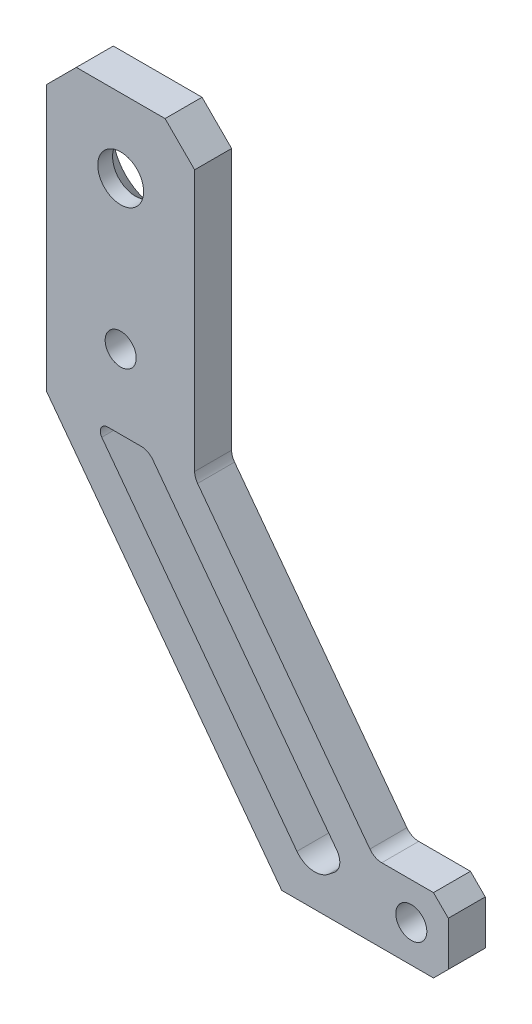
ISO-10303-21;
HEADER;
FILE_DESCRIPTION(('STEP AP214'),'2;1');
FILE_NAME('part.step','',(''),(''),'','','');
FILE_SCHEMA(('AUTOMOTIVE_DESIGN { 1 0 10303 214 1 1 1 1 }'));
ENDSEC;
DATA;
#1=APPLICATION_CONTEXT('core data for automotive mechanical design processes');
#2=APPLICATION_PROTOCOL_DEFINITION('international standard','automotive_design',2000,#1);
#3=PRODUCT_CONTEXT('',#1,'mechanical');
#4=PRODUCT('Part','Part','',(#3));
#5=PRODUCT_RELATED_PRODUCT_CATEGORY('part','',(#4));
#6=PRODUCT_DEFINITION_FORMATION('','',#4);
#7=PRODUCT_DEFINITION_CONTEXT('part definition',#1,'design');
#8=PRODUCT_DEFINITION('design','',#6,#7);
#9=PRODUCT_DEFINITION_SHAPE('','',#8);
#10=(LENGTH_UNIT() NAMED_UNIT(*) SI_UNIT(.MILLI.,.METRE.));
#11=(NAMED_UNIT(*) PLANE_ANGLE_UNIT() SI_UNIT($,.RADIAN.));
#12=(NAMED_UNIT(*) SI_UNIT($,.STERADIAN.) SOLID_ANGLE_UNIT());
#13=UNCERTAINTY_MEASURE_WITH_UNIT(LENGTH_MEASURE(1.E-05),#10,'distance_accuracy_value','');
#14=(GEOMETRIC_REPRESENTATION_CONTEXT(3) GLOBAL_UNCERTAINTY_ASSIGNED_CONTEXT((#13)) GLOBAL_UNIT_ASSIGNED_CONTEXT((#10,
#11,#12)) REPRESENTATION_CONTEXT('',''));
#15=CARTESIAN_POINT('',(0.,0.,0.));
#16=DIRECTION('',(0.,0.,1.));
#17=DIRECTION('',(1.,0.,0.));
#18=AXIS2_PLACEMENT_3D('',#15,#16,#17);
#19=CARTESIAN_POINT('',(0.,0.,2.5));
#20=DIRECTION('',(0.,0.,1.));
#21=DIRECTION('',(1.,0.,0.));
#22=AXIS2_PLACEMENT_3D('',#19,#20,#21);
#23=PLANE('',#22);
#24=CARTESIAN_POINT('',(0.,-20.,2.5));
#25=DIRECTION('',(0.,0.,1.));
#26=DIRECTION('',(1.,0.,0.));
#27=AXIS2_PLACEMENT_3D('',#24,#25,#26);
#28=CIRCLE('',#27,2.1);
#29=CARTESIAN_POINT('',(2.1,-20.,2.5));
#30=VERTEX_POINT('',#29);
#31=EDGE_CURVE('E527',#30,#30,#28,.T.);
#32=ORIENTED_EDGE('',*,*,#31,.F.);
#33=EDGE_LOOP('',(#32));
#34=FACE_BOUND('',#33,.T.);
#35=CARTESIAN_POINT('',(39.3,-67.5,2.5));
#36=DIRECTION('',(0.,0.,1.));
#37=DIRECTION('',(1.,0.,0.));
#38=AXIS2_PLACEMENT_3D('',#35,#36,#37);
#39=CIRCLE('',#38,2.1);
#40=CARTESIAN_POINT('',(41.4,-67.5,2.5));
#41=VERTEX_POINT('',#40);
#42=EDGE_CURVE('E230',#41,#41,#39,.T.);
#43=ORIENTED_EDGE('',*,*,#42,.F.);
#44=EDGE_LOOP('',(#43));
#45=FACE_BOUND('',#44,.T.);
#46=DIRECTION('',(1.,0.,0.));
#47=VECTOR('',#46,1.);
#48=CARTESIAN_POINT('',(21.7769230769231,-72.5,2.5));
#49=LINE('',#48,#47);
#50=CARTESIAN_POINT('',(21.7769230769231,-72.5,2.5));
#51=VERTEX_POINT('',#50);
#52=CARTESIAN_POINT('',(42.3,-72.5,2.5));
#53=VERTEX_POINT('',#52);
#54=EDGE_CURVE('E211',#51,#53,#49,.T.);
#55=ORIENTED_EDGE('',*,*,#54,.T.);
#56=DIRECTION('',(-0.707106781186552,-0.707106781186543,0.));
#57=VECTOR('',#56,1.);
#58=CARTESIAN_POINT('',(57.3999999999997,-57.4000000000005,2.5));
#59=LINE('',#58,#57);
#60=CARTESIAN_POINT('',(44.3,-70.5,2.5));
#61=VERTEX_POINT('',#60);
#62=EDGE_CURVE('E326',#53,#61,#59,.F.);
#63=ORIENTED_EDGE('',*,*,#62,.T.);
#64=DIRECTION('',(0.,1.,0.));
#65=VECTOR('',#64,1.);
#66=CARTESIAN_POINT('',(44.3,-72.5,2.5));
#67=LINE('',#66,#65);
#68=CARTESIAN_POINT('',(44.3,-64.5,2.5));
#69=VERTEX_POINT('',#68);
#70=EDGE_CURVE('E213',#61,#69,#67,.T.);
#71=ORIENTED_EDGE('',*,*,#70,.T.);
#72=DIRECTION('',(0.707106781186544,-0.707106781186551,0.));
#73=VECTOR('',#72,1.);
#74=CARTESIAN_POINT('',(-10.0999999999998,-10.0999999999997,2.5));
#75=LINE('',#74,#73);
#76=CARTESIAN_POINT('',(42.3,-62.5,2.5));
#77=VERTEX_POINT('',#76);
#78=EDGE_CURVE('E324',#69,#77,#75,.F.);
#79=ORIENTED_EDGE('',*,*,#78,.T.);
#80=DIRECTION('',(-1.,0.,0.));
#81=VECTOR('',#80,1.);
#82=CARTESIAN_POINT('',(44.3,-62.5,2.5));
#83=LINE('',#82,#81);
#84=CARTESIAN_POINT('',(35.3018488834955,-62.5,2.5));
#85=VERTEX_POINT('',#84);
#86=EDGE_CURVE('E219',#77,#85,#83,.T.);
#87=ORIENTED_EDGE('',*,*,#86,.T.);
#88=CARTESIAN_POINT('',(35.3018488834955,-60.5,2.5));
#89=DIRECTION('',(0.,0.,1.));
#90=DIRECTION('',(1.,0.,0.));
#91=AXIS2_PLACEMENT_3D('',#88,#89,#90);
#92=CIRCLE('',#91,2.);
#93=CARTESIAN_POINT('',(33.7000763613049,-61.6976329935148,2.5));
#94=VERTEX_POINT('',#93);
#95=EDGE_CURVE('E272',#85,#94,#92,.F.);
#96=ORIENTED_EDGE('',*,*,#95,.T.);
#97=DIRECTION('',(-0.598816496757402,0.80088626109529,0.));
#98=VECTOR('',#97,1.);
#99=CARTESIAN_POINT('',(34.3,-62.5,2.5));
#100=LINE('',#99,#98);
#101=CARTESIAN_POINT('',(10.3982274778094,-30.5326087666175,2.5));
#102=VERTEX_POINT('',#101);
#103=EDGE_CURVE('E221',#94,#102,#100,.T.);
#104=ORIENTED_EDGE('',*,*,#103,.T.);
#105=CARTESIAN_POINT('',(12.,-29.3349757731027,2.5));
#106=DIRECTION('',(0.,0.,1.));
#107=DIRECTION('',(1.,0.,0.));
#108=AXIS2_PLACEMENT_3D('',#105,#106,#107);
#109=CIRCLE('',#108,2.);
#110=CARTESIAN_POINT('',(10.,-29.3349757731027,2.5));
#111=VERTEX_POINT('',#110);
#112=EDGE_CURVE('E276',#102,#111,#109,.F.);
#113=ORIENTED_EDGE('',*,*,#112,.T.);
#114=DIRECTION('',(0.,1.,0.));
#115=VECTOR('',#114,1.);
#116=CARTESIAN_POINT('',(10.,-30.,2.5));
#117=LINE('',#116,#115);
#118=CARTESIAN_POINT('',(10.,6.,2.5));
#119=VERTEX_POINT('',#118);
#120=EDGE_CURVE('E224',#111,#119,#117,.T.);
#121=ORIENTED_EDGE('',*,*,#120,.T.);
#122=DIRECTION('',(0.707106781186546,-0.707106781186549,0.));
#123=VECTOR('',#122,1.);
#124=CARTESIAN_POINT('',(8.00000000000002,7.99999999999999,2.5));
#125=LINE('',#124,#123);
#126=CARTESIAN_POINT('',(6.00000000000001,10.,2.5));
#127=VERTEX_POINT('',#126);
#128=EDGE_CURVE('E309',#119,#127,#125,.F.);
#129=ORIENTED_EDGE('',*,*,#128,.T.);
#130=DIRECTION('',(-1.,0.,0.));
#131=VECTOR('',#130,1.);
#132=CARTESIAN_POINT('',(10.,10.,2.5));
#133=LINE('',#132,#131);
#134=CARTESIAN_POINT('',(-6.,10.,2.5));
#135=VERTEX_POINT('',#134);
#136=EDGE_CURVE('E196',#127,#135,#133,.T.);
#137=ORIENTED_EDGE('',*,*,#136,.T.);
#138=DIRECTION('',(0.707106781186549,0.707106781186546,0.));
#139=VECTOR('',#138,1.);
#140=CARTESIAN_POINT('',(-7.99999999999999,8.00000000000002,2.5));
#141=LINE('',#140,#139);
#142=CARTESIAN_POINT('',(-10.,6.00000000000001,2.5));
#143=VERTEX_POINT('',#142);
#144=EDGE_CURVE('E192',#135,#143,#141,.F.);
#145=ORIENTED_EDGE('',*,*,#144,.T.);
#146=DIRECTION('',(0.,-1.,0.));
#147=VECTOR('',#146,1.);
#148=CARTESIAN_POINT('',(-10.,10.,2.5));
#149=LINE('',#148,#147);
#150=CARTESIAN_POINT('',(-9.99999999999999,-30.,2.5));
#151=VERTEX_POINT('',#150);
#152=EDGE_CURVE('E183',#143,#151,#149,.T.);
#153=ORIENTED_EDGE('',*,*,#152,.T.);
#154=DIRECTION('',(0.598816496757402,-0.80088626109529,0.));
#155=VECTOR('',#154,1.);
#156=CARTESIAN_POINT('',(-9.99999999999999,-30.,2.5));
#157=LINE('',#156,#155);
#158=EDGE_CURVE('E188',#151,#51,#157,.T.);
#159=ORIENTED_EDGE('',*,*,#158,.T.);
#160=EDGE_LOOP('',(#55,#63,#71,#79,#87,#96,#104,#113,#121,#129,#137,#145,#153,#159));
#161=FACE_BOUND('',#160,.T.);
#162=CARTESIAN_POINT('',(0.,0.,2.5));
#163=DIRECTION('',(0.,0.,1.));
#164=DIRECTION('',(1.,0.,0.));
#165=AXIS2_PLACEMENT_3D('',#162,#163,#164);
#166=CIRCLE('',#165,3.1);
#167=CARTESIAN_POINT('',(3.1,0.,2.5));
#168=VERTEX_POINT('',#167);
#169=EDGE_CURVE('E458',#168,#168,#166,.T.);
#170=ORIENTED_EDGE('',*,*,#169,.F.);
#171=EDGE_LOOP('',(#170));
#172=FACE_BOUND('',#171,.T.);
#173=DIRECTION('',(0.781430437850523,0.623992364376953,0.));
#174=VECTOR('',#173,1.);
#175=CARTESIAN_POINT('',(25.6860539770931,-69.3784581263998,2.5));
#176=LINE('',#175,#174);
#177=CARTESIAN_POINT('',(28.1061503386972,-67.4459487467406,2.5));
#178=VERTEX_POINT('',#177);
#179=CARTESIAN_POINT('',(28.8769619540967,-66.8304357860407,2.5));
#180=VERTEX_POINT('',#179);
#181=EDGE_CURVE('E465',#178,#180,#176,.T.);
#182=ORIENTED_EDGE('',*,*,#181,.F.);
#183=CARTESIAN_POINT('',(26.2341732455664,-65.101657433189,2.5));
#184=DIRECTION('',(0.,0.,1.));
#185=DIRECTION('',(1.,0.,0.));
#186=AXIS2_PLACEMENT_3D('',#183,#184,#185);
#187=CIRCLE('',#186,3.);
#188=CARTESIAN_POINT('',(23.8315144622805,-66.8981069234612,2.5));
#189=VERTEX_POINT('',#188);
#190=EDGE_CURVE('E294',#178,#189,#187,.F.);
#191=ORIENTED_EDGE('',*,*,#190,.T.);
#192=DIRECTION('',(0.598816496757401,-0.80088626109529,0.));
#193=VECTOR('',#192,1.);
#194=CARTESIAN_POINT('',(-3.75691625279971,-30.,2.5));
#195=LINE('',#194,#193);
#196=CARTESIAN_POINT('',(-2.56149345676264,-31.5988164967574,2.5));
#197=VERTEX_POINT('',#196);
#198=EDGE_CURVE('E454',#197,#189,#195,.T.);
#199=ORIENTED_EDGE('',*,*,#198,.F.);
#200=CARTESIAN_POINT('',(-1.76060719566735,-31.,2.5));
#201=DIRECTION('',(0.,0.,1.));
#202=DIRECTION('',(1.,0.,0.));
#203=AXIS2_PLACEMENT_3D('',#200,#201,#202);
#204=CIRCLE('',#203,1.);
#205=CARTESIAN_POINT('',(-1.76060719566735,-30.,2.5));
#206=VERTEX_POINT('',#205);
#207=EDGE_CURVE('E336',#197,#206,#204,.F.);
#208=ORIENTED_EDGE('',*,*,#207,.T.);
#209=DIRECTION('',(-1.,0.,0.));
#210=VECTOR('',#209,1.);
#211=CARTESIAN_POINT('',(-3.75691625279971,-30.,2.5));
#212=LINE('',#211,#210);
#213=CARTESIAN_POINT('',(2.75506736930424,-30.,2.5));
#214=VERTEX_POINT('',#213);
#215=EDGE_CURVE('E452',#214,#206,#212,.T.);
#216=ORIENTED_EDGE('',*,*,#215,.F.);
#217=CARTESIAN_POINT('',(2.75506736930424,-32.,2.5));
#218=DIRECTION('',(0.,0.,1.));
#219=DIRECTION('',(1.,0.,0.));
#220=AXIS2_PLACEMENT_3D('',#217,#218,#219);
#221=CIRCLE('',#220,2.);
#222=CARTESIAN_POINT('',(4.35683989149483,-30.8023670064852,2.5));
#223=VERTEX_POINT('',#222);
#224=EDGE_CURVE('E280',#214,#223,#221,.F.);
#225=ORIENTED_EDGE('',*,*,#224,.T.);
#226=DIRECTION('',(-0.598816496757401,0.80088626109529,0.));
#227=VECTOR('',#226,1.);
#228=CARTESIAN_POINT('',(30.39086909983,-65.6215418736001,2.5));
#229=LINE('',#228,#227);
#230=CARTESIAN_POINT('',(29.2307497475334,-64.0699419168248,2.5));
#231=VERTEX_POINT('',#230);
#232=EDGE_CURVE('E459',#231,#223,#229,.T.);
#233=ORIENTED_EDGE('',*,*,#232,.F.);
#234=CARTESIAN_POINT('',(27.6289772253428,-65.2675749103396,2.5));
#235=DIRECTION('',(0.,0.,1.));
#236=DIRECTION('',(1.,0.,0.));
#237=AXIS2_PLACEMENT_3D('',#234,#235,#236);
#238=CIRCLE('',#237,2.);
#239=EDGE_CURVE('E284',#231,#180,#238,.F.);
#240=ORIENTED_EDGE('',*,*,#239,.T.);
#241=EDGE_LOOP('',(#182,#191,#199,#208,#216,#225,#233,#240));
#242=FACE_BOUND('',#241,.T.);
#243=ADVANCED_FACE('F34',(#34,#45,#161,#172,#242),#23,.T.);
#244=CARTESIAN_POINT('',(0.,0.,-2.5));
#245=DIRECTION('',(0.,0.,1.));
#246=DIRECTION('',(1.,0.,0.));
#247=AXIS2_PLACEMENT_3D('',#244,#245,#246);
#248=PLANE('',#247);
#249=CARTESIAN_POINT('',(0.,0.,-2.5));
#250=DIRECTION('',(0.,0.,1.));
#251=DIRECTION('',(1.,0.,0.));
#252=AXIS2_PLACEMENT_3D('',#249,#250,#251);
#253=CIRCLE('',#252,6.09999999999999);
#254=CARTESIAN_POINT('',(6.09999999999999,0.,-2.5));
#255=VERTEX_POINT('',#254);
#256=EDGE_CURVE('E43',#255,#255,#253,.T.);
#257=ORIENTED_EDGE('',*,*,#256,.T.);
#258=EDGE_LOOP('',(#257));
#259=FACE_BOUND('',#258,.T.);
#260=CARTESIAN_POINT('',(0.,-20.,-2.5));
#261=DIRECTION('',(0.,0.,1.));
#262=DIRECTION('',(1.,0.,0.));
#263=AXIS2_PLACEMENT_3D('',#260,#261,#262);
#264=CIRCLE('',#263,2.1);
#265=CARTESIAN_POINT('',(2.1,-20.,-2.5));
#266=VERTEX_POINT('',#265);
#267=EDGE_CURVE('E472',#266,#266,#264,.T.);
#268=ORIENTED_EDGE('',*,*,#267,.T.);
#269=EDGE_LOOP('',(#268));
#270=FACE_BOUND('',#269,.T.);
#271=CARTESIAN_POINT('',(39.3,-67.5,-2.5));
#272=DIRECTION('',(0.,0.,1.));
#273=DIRECTION('',(1.,0.,0.));
#274=AXIS2_PLACEMENT_3D('',#271,#272,#273);
#275=CIRCLE('',#274,2.1);
#276=CARTESIAN_POINT('',(41.4,-67.5,-2.5));
#277=VERTEX_POINT('',#276);
#278=EDGE_CURVE('E462',#277,#277,#275,.T.);
#279=ORIENTED_EDGE('',*,*,#278,.T.);
#280=EDGE_LOOP('',(#279));
#281=FACE_BOUND('',#280,.T.);
#282=DIRECTION('',(0.,1.,0.));
#283=VECTOR('',#282,1.);
#284=CARTESIAN_POINT('',(44.3,-72.5,-2.5));
#285=LINE('',#284,#283);
#286=CARTESIAN_POINT('',(44.3,-70.5,-2.5));
#287=VERTEX_POINT('',#286);
#288=CARTESIAN_POINT('',(44.3,-64.5,-2.5));
#289=VERTEX_POINT('',#288);
#290=EDGE_CURVE('E237',#287,#289,#285,.T.);
#291=ORIENTED_EDGE('',*,*,#290,.F.);
#292=DIRECTION('',(0.707106781186552,0.707106781186543,0.));
#293=VECTOR('',#292,1.);
#294=CARTESIAN_POINT('',(44.3,-70.5,-2.5));
#295=LINE('',#294,#293);
#296=CARTESIAN_POINT('',(42.3,-72.5,-2.5));
#297=VERTEX_POINT('',#296);
#298=EDGE_CURVE('E320',#287,#297,#295,.F.);
#299=ORIENTED_EDGE('',*,*,#298,.T.);
#300=DIRECTION('',(1.,0.,0.));
#301=VECTOR('',#300,1.);
#302=CARTESIAN_POINT('',(21.7769230769231,-72.5,-2.5));
#303=LINE('',#302,#301);
#304=CARTESIAN_POINT('',(21.7769230769231,-72.5,-2.5));
#305=VERTEX_POINT('',#304);
#306=EDGE_CURVE('E234',#305,#297,#303,.T.);
#307=ORIENTED_EDGE('',*,*,#306,.F.);
#308=DIRECTION('',(0.598816496757402,-0.80088626109529,0.));
#309=VECTOR('',#308,1.);
#310=CARTESIAN_POINT('',(-9.99999999999999,-30.,-2.5));
#311=LINE('',#310,#309);
#312=CARTESIAN_POINT('',(-9.99999999999999,-30.,-2.5));
#313=VERTEX_POINT('',#312);
#314=EDGE_CURVE('E232',#313,#305,#311,.T.);
#315=ORIENTED_EDGE('',*,*,#314,.F.);
#316=DIRECTION('',(0.,-1.,0.));
#317=VECTOR('',#316,1.);
#318=CARTESIAN_POINT('',(-10.,10.,-2.5));
#319=LINE('',#318,#317);
#320=CARTESIAN_POINT('',(-10.,6.00000000000001,-2.5));
#321=VERTEX_POINT('',#320);
#322=EDGE_CURVE('E202',#321,#313,#319,.T.);
#323=ORIENTED_EDGE('',*,*,#322,.F.);
#324=DIRECTION('',(-0.707106781186549,-0.707106781186546,0.));
#325=VECTOR('',#324,1.);
#326=CARTESIAN_POINT('',(-10.,6.00000000000001,-2.5));
#327=LINE('',#326,#325);
#328=CARTESIAN_POINT('',(-6.,10.,-2.5));
#329=VERTEX_POINT('',#328);
#330=EDGE_CURVE('E302',#321,#329,#327,.F.);
#331=ORIENTED_EDGE('',*,*,#330,.T.);
#332=DIRECTION('',(-1.,0.,0.));
#333=VECTOR('',#332,1.);
#334=CARTESIAN_POINT('',(10.,10.,-2.5));
#335=LINE('',#334,#333);
#336=CARTESIAN_POINT('',(6.00000000000001,10.,-2.5));
#337=VERTEX_POINT('',#336);
#338=EDGE_CURVE('E227',#337,#329,#335,.T.);
#339=ORIENTED_EDGE('',*,*,#338,.F.);
#340=DIRECTION('',(-0.707106781186546,0.707106781186549,0.));
#341=VECTOR('',#340,1.);
#342=CARTESIAN_POINT('',(6.00000000000001,10.,-2.5));
#343=LINE('',#342,#341);
#344=CARTESIAN_POINT('',(10.,6.,-2.5));
#345=VERTEX_POINT('',#344);
#346=EDGE_CURVE('E304',#337,#345,#343,.F.);
#347=ORIENTED_EDGE('',*,*,#346,.T.);
#348=DIRECTION('',(0.,1.,0.));
#349=VECTOR('',#348,1.);
#350=CARTESIAN_POINT('',(10.,-30.,-2.5));
#351=LINE('',#350,#349);
#352=CARTESIAN_POINT('',(10.,-29.3349757731027,-2.5));
#353=VERTEX_POINT('',#352);
#354=EDGE_CURVE('E245',#353,#345,#351,.T.);
#355=ORIENTED_EDGE('',*,*,#354,.F.);
#356=CARTESIAN_POINT('',(12.,-29.3349757731027,-2.5));
#357=DIRECTION('',(0.,0.,1.));
#358=DIRECTION('',(1.,0.,0.));
#359=AXIS2_PLACEMENT_3D('',#356,#357,#358);
#360=CIRCLE('',#359,2.);
#361=CARTESIAN_POINT('',(10.3982274778094,-30.5326087666175,-2.5));
#362=VERTEX_POINT('',#361);
#363=EDGE_CURVE('E274',#353,#362,#360,.T.);
#364=ORIENTED_EDGE('',*,*,#363,.T.);
#365=DIRECTION('',(-0.598816496757402,0.80088626109529,0.));
#366=VECTOR('',#365,1.);
#367=CARTESIAN_POINT('',(34.3,-62.5,-2.5));
#368=LINE('',#367,#366);
#369=CARTESIAN_POINT('',(33.7000763613049,-61.6976329935148,-2.5));
#370=VERTEX_POINT('',#369);
#371=EDGE_CURVE('E242',#370,#362,#368,.T.);
#372=ORIENTED_EDGE('',*,*,#371,.F.);
#373=CARTESIAN_POINT('',(35.3018488834955,-60.5,-2.5));
#374=DIRECTION('',(0.,0.,1.));
#375=DIRECTION('',(1.,0.,0.));
#376=AXIS2_PLACEMENT_3D('',#373,#374,#375);
#377=CIRCLE('',#376,2.);
#378=CARTESIAN_POINT('',(35.3018488834955,-62.5,-2.5));
#379=VERTEX_POINT('',#378);
#380=EDGE_CURVE('E269',#370,#379,#377,.T.);
#381=ORIENTED_EDGE('',*,*,#380,.T.);
#382=DIRECTION('',(-1.,0.,0.));
#383=VECTOR('',#382,1.);
#384=CARTESIAN_POINT('',(44.3,-62.5,-2.5));
#385=LINE('',#384,#383);
#386=CARTESIAN_POINT('',(42.3,-62.5,-2.5));
#387=VERTEX_POINT('',#386);
#388=EDGE_CURVE('E240',#387,#379,#385,.T.);
#389=ORIENTED_EDGE('',*,*,#388,.F.);
#390=DIRECTION('',(-0.707106781186544,0.707106781186551,0.));
#391=VECTOR('',#390,1.);
#392=CARTESIAN_POINT('',(42.3,-62.5,-2.5));
#393=LINE('',#392,#391);
#394=EDGE_CURVE('E318',#387,#289,#393,.F.);
#395=ORIENTED_EDGE('',*,*,#394,.T.);
#396=EDGE_LOOP('',(#291,#299,#307,#315,#323,#331,#339,#347,#355,#364,#372,#381,#389,#395));
#397=FACE_BOUND('',#396,.T.);
#398=DIRECTION('',(-1.,0.,0.));
#399=VECTOR('',#398,1.);
#400=CARTESIAN_POINT('',(-3.75691625279971,-30.,-2.5));
#401=LINE('',#400,#399);
#402=CARTESIAN_POINT('',(2.75506736930424,-30.,-2.5));
#403=VERTEX_POINT('',#402);
#404=CARTESIAN_POINT('',(-1.76060719566735,-30.,-2.5));
#405=VERTEX_POINT('',#404);
#406=EDGE_CURVE('E477',#403,#405,#401,.T.);
#407=ORIENTED_EDGE('',*,*,#406,.T.);
#408=CARTESIAN_POINT('',(-1.76060719566735,-31.,-2.5));
#409=DIRECTION('',(0.,0.,1.));
#410=DIRECTION('',(1.,0.,0.));
#411=AXIS2_PLACEMENT_3D('',#408,#409,#410);
#412=CIRCLE('',#411,1.);
#413=CARTESIAN_POINT('',(-2.56149345676264,-31.5988164967574,-2.5));
#414=VERTEX_POINT('',#413);
#415=EDGE_CURVE('E50',#405,#414,#412,.T.);
#416=ORIENTED_EDGE('',*,*,#415,.T.);
#417=DIRECTION('',(0.598816496757401,-0.80088626109529,0.));
#418=VECTOR('',#417,1.);
#419=CARTESIAN_POINT('',(-3.75691625279971,-30.,-2.5));
#420=LINE('',#419,#418);
#421=CARTESIAN_POINT('',(23.8315144622805,-66.8981069234612,-2.5));
#422=VERTEX_POINT('',#421);
#423=EDGE_CURVE('E469',#414,#422,#420,.T.);
#424=ORIENTED_EDGE('',*,*,#423,.T.);
#425=CARTESIAN_POINT('',(26.2341732455664,-65.101657433189,-2.5));
#426=DIRECTION('',(0.,0.,1.));
#427=DIRECTION('',(1.,0.,0.));
#428=AXIS2_PLACEMENT_3D('',#425,#426,#427);
#429=CIRCLE('',#428,3.);
#430=CARTESIAN_POINT('',(28.1061503386972,-67.4459487467406,-2.5));
#431=VERTEX_POINT('',#430);
#432=EDGE_CURVE('E292',#422,#431,#429,.T.);
#433=ORIENTED_EDGE('',*,*,#432,.T.);
#434=DIRECTION('',(0.781430437850523,0.623992364376953,0.));
#435=VECTOR('',#434,1.);
#436=CARTESIAN_POINT('',(25.6860539770931,-69.3784581263998,-2.5));
#437=LINE('',#436,#435);
#438=CARTESIAN_POINT('',(28.8769619540967,-66.8304357860407,-2.5));
#439=VERTEX_POINT('',#438);
#440=EDGE_CURVE('E471',#431,#439,#437,.T.);
#441=ORIENTED_EDGE('',*,*,#440,.T.);
#442=CARTESIAN_POINT('',(27.6289772253428,-65.2675749103396,-2.5));
#443=DIRECTION('',(0.,0.,1.));
#444=DIRECTION('',(1.,0.,0.));
#445=AXIS2_PLACEMENT_3D('',#442,#443,#444);
#446=CIRCLE('',#445,2.);
#447=CARTESIAN_POINT('',(29.2307497475334,-64.0699419168248,-2.5));
#448=VERTEX_POINT('',#447);
#449=EDGE_CURVE('E282',#439,#448,#446,.T.);
#450=ORIENTED_EDGE('',*,*,#449,.T.);
#451=DIRECTION('',(-0.598816496757401,0.80088626109529,0.));
#452=VECTOR('',#451,1.);
#453=CARTESIAN_POINT('',(30.39086909983,-65.6215418736001,-2.5));
#454=LINE('',#453,#452);
#455=CARTESIAN_POINT('',(4.35683989149483,-30.8023670064852,-2.5));
#456=VERTEX_POINT('',#455);
#457=EDGE_CURVE('E474',#448,#456,#454,.T.);
#458=ORIENTED_EDGE('',*,*,#457,.T.);
#459=CARTESIAN_POINT('',(2.75506736930424,-32.,-2.5));
#460=DIRECTION('',(0.,0.,1.));
#461=DIRECTION('',(1.,0.,0.));
#462=AXIS2_PLACEMENT_3D('',#459,#460,#461);
#463=CIRCLE('',#462,2.);
#464=EDGE_CURVE('E278',#456,#403,#463,.T.);
#465=ORIENTED_EDGE('',*,*,#464,.T.);
#466=EDGE_LOOP('',(#407,#416,#424,#433,#441,#450,#458,#465));
#467=FACE_BOUND('',#466,.T.);
#468=ADVANCED_FACE('F340',(#259,#270,#281,#397,#467),#248,.F.);
#469=CARTESIAN_POINT('',(10.,10.,2.5));
#470=DIRECTION('',(0.,-1.,0.));
#471=DIRECTION('',(1.,0.,0.));
#472=AXIS2_PLACEMENT_3D('',#469,#470,#471);
#473=PLANE('',#472);
#474=ORIENTED_EDGE('',*,*,#136,.F.);
#475=DIRECTION('',(0.,0.,-1.));
#476=VECTOR('',#475,1.);
#477=CARTESIAN_POINT('',(6.00000000000001,10.,2.5));
#478=LINE('',#477,#476);
#479=EDGE_CURVE('E299',#127,#337,#478,.T.);
#480=ORIENTED_EDGE('',*,*,#479,.T.);
#481=ORIENTED_EDGE('',*,*,#338,.T.);
#482=DIRECTION('',(0.,0.,1.));
#483=VECTOR('',#482,1.);
#484=CARTESIAN_POINT('',(-6.,10.,2.5));
#485=LINE('',#484,#483);
#486=EDGE_CURVE('E297',#329,#135,#485,.T.);
#487=ORIENTED_EDGE('',*,*,#486,.T.);
#488=EDGE_LOOP('',(#474,#480,#481,#487));
#489=FACE_BOUND('',#488,.T.);
#490=ADVANCED_FACE('F359',(#489),#473,.F.);
#491=CARTESIAN_POINT('',(-10.,10.,2.5));
#492=DIRECTION('',(1.,0.,0.));
#493=DIRECTION('',(0.,1.,0.));
#494=AXIS2_PLACEMENT_3D('',#491,#492,#493);
#495=PLANE('',#494);
#496=ORIENTED_EDGE('',*,*,#152,.F.);
#497=DIRECTION('',(0.,0.,-1.));
#498=VECTOR('',#497,1.);
#499=CARTESIAN_POINT('',(-10.,6.00000000000001,2.5));
#500=LINE('',#499,#498);
#501=EDGE_CURVE('E311',#143,#321,#500,.T.);
#502=ORIENTED_EDGE('',*,*,#501,.T.);
#503=ORIENTED_EDGE('',*,*,#322,.T.);
#504=DIRECTION('',(0.,0.,-1.));
#505=VECTOR('',#504,1.);
#506=CARTESIAN_POINT('',(-9.99999999999999,-30.,2.5));
#507=LINE('',#506,#505);
#508=EDGE_CURVE('E199',#151,#313,#507,.T.);
#509=ORIENTED_EDGE('',*,*,#508,.F.);
#510=EDGE_LOOP('',(#496,#502,#503,#509));
#511=FACE_BOUND('',#510,.T.);
#512=ADVANCED_FACE('F200',(#511),#495,.F.);
#513=CARTESIAN_POINT('',(-9.99999999999999,-30.,2.5));
#514=DIRECTION('',(0.80088626109529,0.598816496757402,0.));
#515=DIRECTION('',(-0.598816496757402,0.80088626109529,0.));
#516=AXIS2_PLACEMENT_3D('',#513,#514,#515);
#517=PLANE('',#516);
#518=ORIENTED_EDGE('',*,*,#314,.T.);
#519=DIRECTION('',(0.,0.,-1.));
#520=VECTOR('',#519,1.);
#521=CARTESIAN_POINT('',(21.7769230769231,-72.5,2.5));
#522=LINE('',#521,#520);
#523=EDGE_CURVE('E206',#51,#305,#522,.T.);
#524=ORIENTED_EDGE('',*,*,#523,.F.);
#525=ORIENTED_EDGE('',*,*,#158,.F.);
#526=ORIENTED_EDGE('',*,*,#508,.T.);
#527=EDGE_LOOP('',(#518,#524,#525,#526));
#528=FACE_BOUND('',#527,.T.);
#529=ADVANCED_FACE('F208',(#528),#517,.F.);
#530=CARTESIAN_POINT('',(21.7769230769231,-72.5,2.5));
#531=DIRECTION('',(0.,1.,0.));
#532=DIRECTION('',(0.,0.,1.));
#533=AXIS2_PLACEMENT_3D('',#530,#531,#532);
#534=PLANE('',#533);
#535=ORIENTED_EDGE('',*,*,#306,.T.);
#536=DIRECTION('',(0.,0.,1.));
#537=VECTOR('',#536,1.);
#538=CARTESIAN_POINT('',(42.3,-72.5,2.5));
#539=LINE('',#538,#537);
#540=EDGE_CURVE('E322',#297,#53,#539,.T.);
#541=ORIENTED_EDGE('',*,*,#540,.T.);
#542=ORIENTED_EDGE('',*,*,#54,.F.);
#543=ORIENTED_EDGE('',*,*,#523,.T.);
#544=EDGE_LOOP('',(#535,#541,#542,#543));
#545=FACE_BOUND('',#544,.T.);
#546=ADVANCED_FACE('F382',(#545),#534,.F.);
#547=CARTESIAN_POINT('',(44.3,-72.5,2.5));
#548=DIRECTION('',(-1.,0.,0.));
#549=DIRECTION('',(0.,-1.,0.));
#550=AXIS2_PLACEMENT_3D('',#547,#548,#549);
#551=PLANE('',#550);
#552=ORIENTED_EDGE('',*,*,#70,.F.);
#553=DIRECTION('',(0.,0.,-1.));
#554=VECTOR('',#553,1.);
#555=CARTESIAN_POINT('',(44.3,-70.5,2.5));
#556=LINE('',#555,#554);
#557=EDGE_CURVE('E315',#61,#287,#556,.T.);
#558=ORIENTED_EDGE('',*,*,#557,.T.);
#559=ORIENTED_EDGE('',*,*,#290,.T.);
#560=DIRECTION('',(0.,0.,1.));
#561=VECTOR('',#560,1.);
#562=CARTESIAN_POINT('',(44.3,-64.5,2.5));
#563=LINE('',#562,#561);
#564=EDGE_CURVE('E313',#289,#69,#563,.T.);
#565=ORIENTED_EDGE('',*,*,#564,.T.);
#566=EDGE_LOOP('',(#552,#558,#559,#565));
#567=FACE_BOUND('',#566,.T.);
#568=ADVANCED_FACE('F378',(#567),#551,.F.);
#569=CARTESIAN_POINT('',(44.3,-62.5,2.5));
#570=DIRECTION('',(0.,-1.,0.));
#571=DIRECTION('',(1.,0.,0.));
#572=AXIS2_PLACEMENT_3D('',#569,#570,#571);
#573=PLANE('',#572);
#574=ORIENTED_EDGE('',*,*,#86,.F.);
#575=DIRECTION('',(0.,0.,-1.));
#576=VECTOR('',#575,1.);
#577=CARTESIAN_POINT('',(42.3,-62.5,2.5));
#578=LINE('',#577,#576);
#579=EDGE_CURVE('E328',#77,#387,#578,.T.);
#580=ORIENTED_EDGE('',*,*,#579,.T.);
#581=ORIENTED_EDGE('',*,*,#388,.T.);
#582=DIRECTION('',(0.,0.,-1.));
#583=VECTOR('',#582,1.);
#584=CARTESIAN_POINT('',(35.3018488834955,-62.5,2.5));
#585=LINE('',#584,#583);
#586=EDGE_CURVE('E253',#379,#85,#585,.F.);
#587=ORIENTED_EDGE('',*,*,#586,.T.);
#588=EDGE_LOOP('',(#574,#580,#581,#587));
#589=FACE_BOUND('',#588,.T.);
#590=ADVANCED_FACE('F374',(#589),#573,.F.);
#591=CARTESIAN_POINT('',(34.3,-62.5,2.5));
#592=DIRECTION('',(-0.80088626109529,-0.598816496757402,0.));
#593=DIRECTION('',(0.598816496757402,-0.80088626109529,0.));
#594=AXIS2_PLACEMENT_3D('',#591,#592,#593);
#595=PLANE('',#594);
#596=ORIENTED_EDGE('',*,*,#103,.F.);
#597=DIRECTION('',(0.,0.,-1.));
#598=VECTOR('',#597,1.);
#599=CARTESIAN_POINT('',(33.7000763613049,-61.6976329935148,-2.5));
#600=LINE('',#599,#598);
#601=EDGE_CURVE('E250',#94,#370,#600,.T.);
#602=ORIENTED_EDGE('',*,*,#601,.T.);
#603=ORIENTED_EDGE('',*,*,#371,.T.);
#604=DIRECTION('',(0.,0.,-1.));
#605=VECTOR('',#604,1.);
#606=CARTESIAN_POINT('',(10.3982274778094,-30.5326087666175,2.5));
#607=LINE('',#606,#605);
#608=EDGE_CURVE('E205',#362,#102,#607,.F.);
#609=ORIENTED_EDGE('',*,*,#608,.T.);
#610=EDGE_LOOP('',(#596,#602,#603,#609));
#611=FACE_BOUND('',#610,.T.);
#612=ADVANCED_FACE('F370',(#611),#595,.F.);
#613=CARTESIAN_POINT('',(10.,-30.,2.5));
#614=DIRECTION('',(-1.,0.,0.));
#615=DIRECTION('',(0.,-1.,0.));
#616=AXIS2_PLACEMENT_3D('',#613,#614,#615);
#617=PLANE('',#616);
#618=ORIENTED_EDGE('',*,*,#354,.T.);
#619=DIRECTION('',(0.,0.,1.));
#620=VECTOR('',#619,1.);
#621=CARTESIAN_POINT('',(10.,6.,2.5));
#622=LINE('',#621,#620);
#623=EDGE_CURVE('E306',#345,#119,#622,.T.);
#624=ORIENTED_EDGE('',*,*,#623,.T.);
#625=ORIENTED_EDGE('',*,*,#120,.F.);
#626=DIRECTION('',(0.,0.,-1.));
#627=VECTOR('',#626,1.);
#628=CARTESIAN_POINT('',(10.,-29.3349757731027,-2.5));
#629=LINE('',#628,#627);
#630=EDGE_CURVE('E256',#111,#353,#629,.T.);
#631=ORIENTED_EDGE('',*,*,#630,.T.);
#632=EDGE_LOOP('',(#618,#624,#625,#631));
#633=FACE_BOUND('',#632,.T.);
#634=ADVANCED_FACE('F367',(#633),#617,.F.);
#635=CARTESIAN_POINT('',(39.3,-67.5,2.5));
#636=DIRECTION('',(0.,0.,-1.));
#637=DIRECTION('',(-1.,0.,0.));
#638=AXIS2_PLACEMENT_3D('',#635,#636,#637);
#639=CYLINDRICAL_SURFACE('',#638,2.1);
#640=ORIENTED_EDGE('',*,*,#42,.T.);
#641=EDGE_LOOP('',(#640));
#642=FACE_BOUND('',#641,.T.);
#643=ORIENTED_EDGE('',*,*,#278,.F.);
#644=EDGE_LOOP('',(#643));
#645=FACE_BOUND('',#644,.T.);
#646=ADVANCED_FACE('F364',(#642,#645),#639,.F.);
#647=CARTESIAN_POINT('',(0.,0.,2.5));
#648=DIRECTION('',(0.,0.,-1.));
#649=DIRECTION('',(-1.,0.,0.));
#650=AXIS2_PLACEMENT_3D('',#647,#648,#649);
#651=CYLINDRICAL_SURFACE('',#650,3.1);
#652=CARTESIAN_POINT('',(0.,0.,0.500000000000011));
#653=DIRECTION('',(0.,0.,1.));
#654=DIRECTION('',(1.,0.,0.));
#655=AXIS2_PLACEMENT_3D('',#652,#653,#654);
#656=CIRCLE('',#655,3.1);
#657=CARTESIAN_POINT('',(3.1,0.,0.500000000000011));
#658=VERTEX_POINT('',#657);
#659=EDGE_CURVE('E11',#658,#658,#656,.F.);
#660=ORIENTED_EDGE('',*,*,#659,.T.);
#661=EDGE_LOOP('',(#660));
#662=FACE_BOUND('',#661,.T.);
#663=ORIENTED_EDGE('',*,*,#169,.T.);
#664=EDGE_LOOP('',(#663));
#665=FACE_BOUND('',#664,.T.);
#666=ADVANCED_FACE('F537',(#662,#665),#651,.F.);
#667=CARTESIAN_POINT('',(-3.75691625279971,-30.,2.5));
#668=DIRECTION('',(0.80088626109529,0.598816496757401,0.));
#669=DIRECTION('',(-0.598816496757401,0.80088626109529,0.));
#670=AXIS2_PLACEMENT_3D('',#667,#668,#669);
#671=PLANE('',#670);
#672=ORIENTED_EDGE('',*,*,#423,.F.);
#673=DIRECTION('',(0.,0.,-1.));
#674=VECTOR('',#673,1.);
#675=CARTESIAN_POINT('',(-2.56149345676264,-31.5988164967574,2.5));
#676=LINE('',#675,#674);
#677=EDGE_CURVE('E57',#414,#197,#676,.F.);
#678=ORIENTED_EDGE('',*,*,#677,.T.);
#679=ORIENTED_EDGE('',*,*,#198,.T.);
#680=DIRECTION('',(0.,0.,-1.));
#681=VECTOR('',#680,1.);
#682=CARTESIAN_POINT('',(23.8315144622805,-66.8981069234612,-2.5));
#683=LINE('',#682,#681);
#684=EDGE_CURVE('E287',#189,#422,#683,.T.);
#685=ORIENTED_EDGE('',*,*,#684,.T.);
#686=EDGE_LOOP('',(#672,#678,#679,#685));
#687=FACE_BOUND('',#686,.T.);
#688=ADVANCED_FACE('F524',(#687),#671,.T.);
#689=CARTESIAN_POINT('',(25.6860539770931,-69.3784581263998,2.5));
#690=DIRECTION('',(-0.623992364376953,0.781430437850523,0.));
#691=DIRECTION('',(-0.781430437850523,-0.623992364376953,0.));
#692=AXIS2_PLACEMENT_3D('',#689,#690,#691);
#693=PLANE('',#692);
#694=ORIENTED_EDGE('',*,*,#440,.F.);
#695=DIRECTION('',(0.,0.,-1.));
#696=VECTOR('',#695,1.);
#697=CARTESIAN_POINT('',(28.1061503386972,-67.4459487467406,2.5));
#698=LINE('',#697,#696);
#699=EDGE_CURVE('E290',#431,#178,#698,.F.);
#700=ORIENTED_EDGE('',*,*,#699,.T.);
#701=ORIENTED_EDGE('',*,*,#181,.T.);
#702=DIRECTION('',(0.,0.,-1.));
#703=VECTOR('',#702,1.);
#704=CARTESIAN_POINT('',(28.8769619540967,-66.8304357860407,-2.5));
#705=LINE('',#704,#703);
#706=EDGE_CURVE('E266',#180,#439,#705,.T.);
#707=ORIENTED_EDGE('',*,*,#706,.T.);
#708=EDGE_LOOP('',(#694,#700,#701,#707));
#709=FACE_BOUND('',#708,.T.);
#710=ADVANCED_FACE('F547',(#709),#693,.T.);
#711=CARTESIAN_POINT('',(30.39086909983,-65.6215418736001,2.5));
#712=DIRECTION('',(-0.80088626109529,-0.598816496757401,0.));
#713=DIRECTION('',(0.598816496757402,-0.80088626109529,0.));
#714=AXIS2_PLACEMENT_3D('',#711,#712,#713);
#715=PLANE('',#714);
#716=ORIENTED_EDGE('',*,*,#232,.T.);
#717=DIRECTION('',(0.,0.,-1.));
#718=VECTOR('',#717,1.);
#719=CARTESIAN_POINT('',(4.35683989149482,-30.8023670064852,-2.5));
#720=LINE('',#719,#718);
#721=EDGE_CURVE('E261',#223,#456,#720,.T.);
#722=ORIENTED_EDGE('',*,*,#721,.T.);
#723=ORIENTED_EDGE('',*,*,#457,.F.);
#724=DIRECTION('',(0.,0.,-1.));
#725=VECTOR('',#724,1.);
#726=CARTESIAN_POINT('',(29.2307497475334,-64.0699419168248,2.5));
#727=LINE('',#726,#725);
#728=EDGE_CURVE('E259',#448,#231,#727,.F.);
#729=ORIENTED_EDGE('',*,*,#728,.T.);
#730=EDGE_LOOP('',(#716,#722,#723,#729));
#731=FACE_BOUND('',#730,.T.);
#732=ADVANCED_FACE('F514',(#731),#715,.T.);
#733=CARTESIAN_POINT('',(-3.75691625279971,-30.,2.5));
#734=DIRECTION('',(0.,-1.,0.));
#735=DIRECTION('',(0.,0.,-1.));
#736=AXIS2_PLACEMENT_3D('',#733,#734,#735);
#737=PLANE('',#736);
#738=ORIENTED_EDGE('',*,*,#215,.T.);
#739=DIRECTION('',(0.,0.,-1.));
#740=VECTOR('',#739,1.);
#741=CARTESIAN_POINT('',(-1.76060719566735,-30.,-2.5));
#742=LINE('',#741,#740);
#743=EDGE_CURVE('E331',#206,#405,#742,.T.);
#744=ORIENTED_EDGE('',*,*,#743,.T.);
#745=ORIENTED_EDGE('',*,*,#406,.F.);
#746=DIRECTION('',(0.,0.,-1.));
#747=VECTOR('',#746,1.);
#748=CARTESIAN_POINT('',(2.75506736930424,-30.,2.5));
#749=LINE('',#748,#747);
#750=EDGE_CURVE('E264',#403,#214,#749,.F.);
#751=ORIENTED_EDGE('',*,*,#750,.T.);
#752=EDGE_LOOP('',(#738,#744,#745,#751));
#753=FACE_BOUND('',#752,.T.);
#754=ADVANCED_FACE('F398',(#753),#737,.T.);
#755=CARTESIAN_POINT('',(35.3018488834955,-60.5,2.5));
#756=DIRECTION('',(0.,0.,1.));
#757=DIRECTION('',(1.,0.,0.));
#758=AXIS2_PLACEMENT_3D('',#755,#756,#757);
#759=CYLINDRICAL_SURFACE('',#758,2.);
#760=ORIENTED_EDGE('',*,*,#95,.F.);
#761=ORIENTED_EDGE('',*,*,#586,.F.);
#762=ORIENTED_EDGE('',*,*,#380,.F.);
#763=ORIENTED_EDGE('',*,*,#601,.F.);
#764=EDGE_LOOP('',(#760,#761,#762,#763));
#765=FACE_BOUND('',#764,.T.);
#766=ADVANCED_FACE('F394',(#765),#759,.F.);
#767=CARTESIAN_POINT('',(12.,-29.3349757731027,2.5));
#768=DIRECTION('',(0.,0.,1.));
#769=DIRECTION('',(1.,0.,0.));
#770=AXIS2_PLACEMENT_3D('',#767,#768,#769);
#771=CYLINDRICAL_SURFACE('',#770,2.);
#772=ORIENTED_EDGE('',*,*,#112,.F.);
#773=ORIENTED_EDGE('',*,*,#608,.F.);
#774=ORIENTED_EDGE('',*,*,#363,.F.);
#775=ORIENTED_EDGE('',*,*,#630,.F.);
#776=EDGE_LOOP('',(#772,#773,#774,#775));
#777=FACE_BOUND('',#776,.T.);
#778=ADVANCED_FACE('F397',(#777),#771,.F.);
#779=CARTESIAN_POINT('',(2.75506736930424,-32.,2.5));
#780=DIRECTION('',(0.,0.,1.));
#781=DIRECTION('',(1.,0.,0.));
#782=AXIS2_PLACEMENT_3D('',#779,#780,#781);
#783=CYLINDRICAL_SURFACE('',#782,2.);
#784=ORIENTED_EDGE('',*,*,#224,.F.);
#785=ORIENTED_EDGE('',*,*,#750,.F.);
#786=ORIENTED_EDGE('',*,*,#464,.F.);
#787=ORIENTED_EDGE('',*,*,#721,.F.);
#788=EDGE_LOOP('',(#784,#785,#786,#787));
#789=FACE_BOUND('',#788,.T.);
#790=ADVANCED_FACE('F402',(#789),#783,.F.);
#791=CARTESIAN_POINT('',(27.6289772253428,-65.2675749103396,2.5));
#792=DIRECTION('',(0.,0.,1.));
#793=DIRECTION('',(1.,0.,0.));
#794=AXIS2_PLACEMENT_3D('',#791,#792,#793);
#795=CYLINDRICAL_SURFACE('',#794,2.);
#796=ORIENTED_EDGE('',*,*,#239,.F.);
#797=ORIENTED_EDGE('',*,*,#728,.F.);
#798=ORIENTED_EDGE('',*,*,#449,.F.);
#799=ORIENTED_EDGE('',*,*,#706,.F.);
#800=EDGE_LOOP('',(#796,#797,#798,#799));
#801=FACE_BOUND('',#800,.T.);
#802=ADVANCED_FACE('F406',(#801),#795,.F.);
#803=CARTESIAN_POINT('',(26.2341732455664,-65.101657433189,2.5));
#804=DIRECTION('',(0.,0.,1.));
#805=DIRECTION('',(1.,0.,0.));
#806=AXIS2_PLACEMENT_3D('',#803,#804,#805);
#807=CYLINDRICAL_SURFACE('',#806,3.);
#808=ORIENTED_EDGE('',*,*,#190,.F.);
#809=ORIENTED_EDGE('',*,*,#699,.F.);
#810=ORIENTED_EDGE('',*,*,#432,.F.);
#811=ORIENTED_EDGE('',*,*,#684,.F.);
#812=EDGE_LOOP('',(#808,#809,#810,#811));
#813=FACE_BOUND('',#812,.T.);
#814=ADVANCED_FACE('F410',(#813),#807,.F.);
#815=CARTESIAN_POINT('',(6.00000000000001,10.,2.5));
#816=DIRECTION('',(-0.707106781186549,-0.707106781186546,0.));
#817=DIRECTION('',(0.,0.,-1.));
#818=AXIS2_PLACEMENT_3D('',#815,#816,#817);
#819=PLANE('',#818);
#820=ORIENTED_EDGE('',*,*,#128,.F.);
#821=ORIENTED_EDGE('',*,*,#623,.F.);
#822=ORIENTED_EDGE('',*,*,#346,.F.);
#823=ORIENTED_EDGE('',*,*,#479,.F.);
#824=EDGE_LOOP('',(#820,#821,#822,#823));
#825=FACE_BOUND('',#824,.T.);
#826=ADVANCED_FACE('F414',(#825),#819,.F.);
#827=CARTESIAN_POINT('',(-10.,6.00000000000001,2.5));
#828=DIRECTION('',(0.707106781186546,-0.707106781186549,0.));
#829=DIRECTION('',(0.,0.,-1.));
#830=AXIS2_PLACEMENT_3D('',#827,#828,#829);
#831=PLANE('',#830);
#832=ORIENTED_EDGE('',*,*,#144,.F.);
#833=ORIENTED_EDGE('',*,*,#486,.F.);
#834=ORIENTED_EDGE('',*,*,#330,.F.);
#835=ORIENTED_EDGE('',*,*,#501,.F.);
#836=EDGE_LOOP('',(#832,#833,#834,#835));
#837=FACE_BOUND('',#836,.T.);
#838=ADVANCED_FACE('F422',(#837),#831,.F.);
#839=CARTESIAN_POINT('',(44.3,-70.5,2.5));
#840=DIRECTION('',(-0.707106781186542,0.707106781186552,0.));
#841=DIRECTION('',(0.,0.,-1.));
#842=AXIS2_PLACEMENT_3D('',#839,#840,#841);
#843=PLANE('',#842);
#844=ORIENTED_EDGE('',*,*,#62,.F.);
#845=ORIENTED_EDGE('',*,*,#540,.F.);
#846=ORIENTED_EDGE('',*,*,#298,.F.);
#847=ORIENTED_EDGE('',*,*,#557,.F.);
#848=EDGE_LOOP('',(#844,#845,#846,#847));
#849=FACE_BOUND('',#848,.T.);
#850=ADVANCED_FACE('F429',(#849),#843,.F.);
#851=CARTESIAN_POINT('',(42.3,-62.5,2.5));
#852=DIRECTION('',(-0.707106781186551,-0.707106781186544,0.));
#853=DIRECTION('',(0.,0.,-1.));
#854=AXIS2_PLACEMENT_3D('',#851,#852,#853);
#855=PLANE('',#854);
#856=ORIENTED_EDGE('',*,*,#78,.F.);
#857=ORIENTED_EDGE('',*,*,#564,.F.);
#858=ORIENTED_EDGE('',*,*,#394,.F.);
#859=ORIENTED_EDGE('',*,*,#579,.F.);
#860=EDGE_LOOP('',(#856,#857,#858,#859));
#861=FACE_BOUND('',#860,.T.);
#862=ADVANCED_FACE('F436',(#861),#855,.F.);
#863=CARTESIAN_POINT('',(-1.76060719566735,-31.,2.5));
#864=DIRECTION('',(0.,0.,1.));
#865=DIRECTION('',(1.,0.,0.));
#866=AXIS2_PLACEMENT_3D('',#863,#864,#865);
#867=CYLINDRICAL_SURFACE('',#866,1.);
#868=ORIENTED_EDGE('',*,*,#207,.F.);
#869=ORIENTED_EDGE('',*,*,#677,.F.);
#870=ORIENTED_EDGE('',*,*,#415,.F.);
#871=ORIENTED_EDGE('',*,*,#743,.F.);
#872=EDGE_LOOP('',(#868,#869,#870,#871));
#873=FACE_BOUND('',#872,.T.);
#874=ADVANCED_FACE('F349',(#873),#867,.F.);
#875=CARTESIAN_POINT('',(0.,-20.,-2.5));
#876=DIRECTION('',(0.,0.,1.));
#877=DIRECTION('',(1.,0.,0.));
#878=AXIS2_PLACEMENT_3D('',#875,#876,#877);
#879=CYLINDRICAL_SURFACE('',#878,2.1);
#880=ORIENTED_EDGE('',*,*,#267,.F.);
#881=EDGE_LOOP('',(#880));
#882=FACE_BOUND('',#881,.T.);
#883=ORIENTED_EDGE('',*,*,#31,.T.);
#884=EDGE_LOOP('',(#883));
#885=FACE_BOUND('',#884,.T.);
#886=ADVANCED_FACE('F344',(#882,#885),#879,.F.);
#887=CARTESIAN_POINT('',(0.,0.,-2.5));
#888=DIRECTION('',(0.,0.,-1.));
#889=DIRECTION('',(-1.,0.,0.));
#890=AXIS2_PLACEMENT_3D('',#887,#888,#889);
#891=CONICAL_SURFACE('',#890,6.09999999999999,0.785398163397446);
#892=ORIENTED_EDGE('',*,*,#659,.F.);
#893=EDGE_LOOP('',(#892));
#894=FACE_BOUND('',#893,.T.);
#895=ORIENTED_EDGE('',*,*,#256,.F.);
#896=EDGE_LOOP('',(#895));
#897=FACE_BOUND('',#896,.T.);
#898=ADVANCED_FACE('F37',(#894,#897),#891,.F.);
#899=CLOSED_SHELL('',(#243,#468,#490,#512,#529,#546,#568,#590,#612,#634,#646,#666,#688,#710,
#732,#754,#766,#778,#790,#802,#814,#826,#838,#850,#862,#874,#886,#898));
#900=MANIFOLD_SOLID_BREP('B2',#899);
#901=ADVANCED_BREP_SHAPE_REPRESENTATION('',(#18,#900),#14);
#902=SHAPE_DEFINITION_REPRESENTATION(#9,#901);
ENDSEC;
END-ISO-10303-21;
